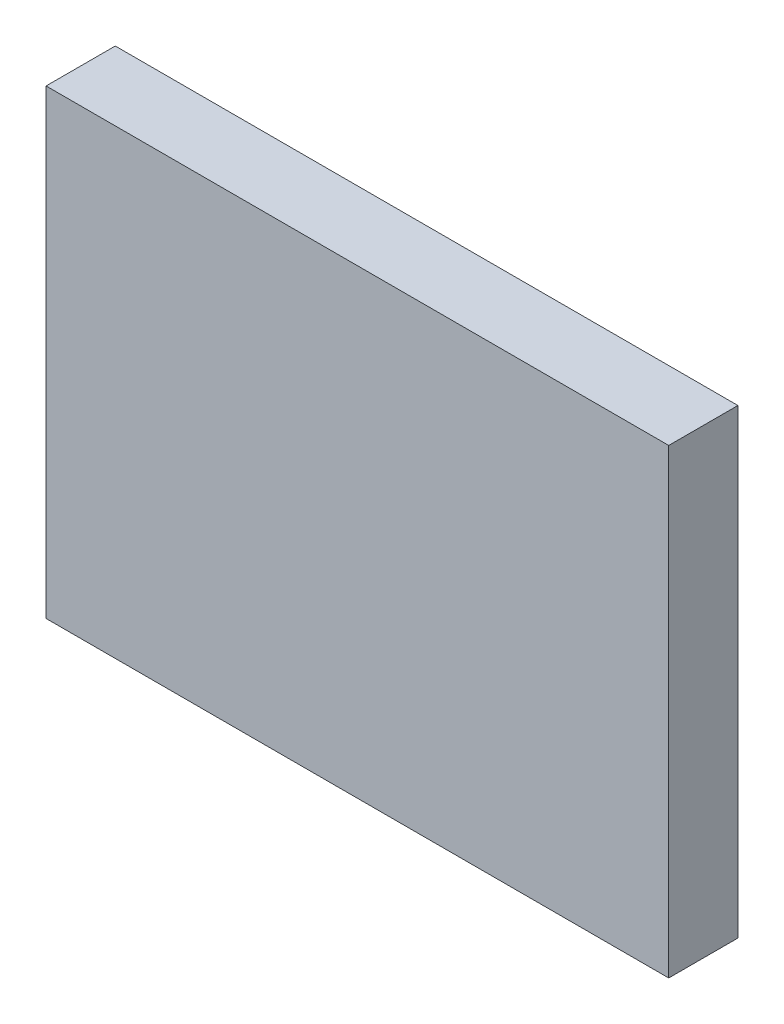
ISO-10303-21;
HEADER;
FILE_DESCRIPTION(('STEP AP214'),'2;1');
FILE_NAME('part.step','',(''),(''),'','','');
FILE_SCHEMA(('AUTOMOTIVE_DESIGN { 1 0 10303 214 1 1 1 1 }'));
ENDSEC;
DATA;
#1=APPLICATION_CONTEXT('core data for automotive mechanical design processes');
#2=APPLICATION_PROTOCOL_DEFINITION('international standard','automotive_design',2000,#1);
#3=PRODUCT_CONTEXT('',#1,'mechanical');
#4=PRODUCT('Part','Part','',(#3));
#5=PRODUCT_RELATED_PRODUCT_CATEGORY('part','',(#4));
#6=PRODUCT_DEFINITION_FORMATION('','',#4);
#7=PRODUCT_DEFINITION_CONTEXT('part definition',#1,'design');
#8=PRODUCT_DEFINITION('design','',#6,#7);
#9=PRODUCT_DEFINITION_SHAPE('','',#8);
#10=(LENGTH_UNIT() NAMED_UNIT(*) SI_UNIT(.MILLI.,.METRE.));
#11=(NAMED_UNIT(*) PLANE_ANGLE_UNIT() SI_UNIT($,.RADIAN.));
#12=(NAMED_UNIT(*) SI_UNIT($,.STERADIAN.) SOLID_ANGLE_UNIT());
#13=UNCERTAINTY_MEASURE_WITH_UNIT(LENGTH_MEASURE(1.E-05),#10,'distance_accuracy_value','');
#14=(GEOMETRIC_REPRESENTATION_CONTEXT(3) GLOBAL_UNCERTAINTY_ASSIGNED_CONTEXT((#13)) GLOBAL_UNIT_ASSIGNED_CONTEXT((#10,
#11,#12)) REPRESENTATION_CONTEXT('',''));
#15=CARTESIAN_POINT('',(0.,0.,0.));
#16=DIRECTION('',(0.,0.,1.));
#17=DIRECTION('',(1.,0.,0.));
#18=AXIS2_PLACEMENT_3D('',#15,#16,#17);
#19=CARTESIAN_POINT('',(-85.725,-63.5,9.525));
#20=DIRECTION('',(-1.,0.,0.));
#21=DIRECTION('',(0.,0.,1.));
#22=AXIS2_PLACEMENT_3D('',#19,#20,#21);
#23=PLANE('',#22);
#24=DIRECTION('',(0.,1.,0.));
#25=VECTOR('',#24,1.);
#26=CARTESIAN_POINT('',(-85.725,-63.5,-9.525));
#27=LINE('',#26,#25);
#28=CARTESIAN_POINT('',(-85.725,-63.5,-9.525));
#29=VERTEX_POINT('',#28);
#30=CARTESIAN_POINT('',(-85.725,63.5,-9.525));
#31=VERTEX_POINT('',#30);
#32=EDGE_CURVE('E110',#29,#31,#27,.T.);
#33=ORIENTED_EDGE('',*,*,#32,.F.);
#34=DIRECTION('',(0.,0.,-1.));
#35=VECTOR('',#34,1.);
#36=CARTESIAN_POINT('',(-85.725,-63.5,9.525));
#37=LINE('',#36,#35);
#38=CARTESIAN_POINT('',(-85.725,-63.5,9.525));
#39=VERTEX_POINT('',#38);
#40=EDGE_CURVE('E11',#39,#29,#37,.T.);
#41=ORIENTED_EDGE('',*,*,#40,.F.);
#42=DIRECTION('',(0.,1.,0.));
#43=VECTOR('',#42,1.);
#44=CARTESIAN_POINT('',(-85.725,-63.5,9.525));
#45=LINE('',#44,#43);
#46=CARTESIAN_POINT('',(-85.725,63.5,9.525));
#47=VERTEX_POINT('',#46);
#48=EDGE_CURVE('E103',#39,#47,#45,.T.);
#49=ORIENTED_EDGE('',*,*,#48,.T.);
#50=DIRECTION('',(0.,0.,-1.));
#51=VECTOR('',#50,1.);
#52=CARTESIAN_POINT('',(-85.725,63.5,9.525));
#53=LINE('',#52,#51);
#54=EDGE_CURVE('E42',#47,#31,#53,.T.);
#55=ORIENTED_EDGE('',*,*,#54,.T.);
#56=EDGE_LOOP('',(#33,#41,#49,#55));
#57=FACE_BOUND('',#56,.T.);
#58=ADVANCED_FACE('F39',(#57),#23,.T.);
#59=CARTESIAN_POINT('',(-85.725,-63.5,9.525));
#60=DIRECTION('',(0.,1.,0.));
#61=DIRECTION('',(0.,0.,1.));
#62=AXIS2_PLACEMENT_3D('',#59,#60,#61);
#63=PLANE('',#62);
#64=DIRECTION('',(1.,0.,0.));
#65=VECTOR('',#64,1.);
#66=CARTESIAN_POINT('',(-85.725,-63.5,-9.525));
#67=LINE('',#66,#65);
#68=CARTESIAN_POINT('',(85.725,-63.5,-9.525));
#69=VERTEX_POINT('',#68);
#70=EDGE_CURVE('E73',#29,#69,#67,.T.);
#71=ORIENTED_EDGE('',*,*,#70,.T.);
#72=DIRECTION('',(0.,0.,-1.));
#73=VECTOR('',#72,1.);
#74=CARTESIAN_POINT('',(85.725,-63.5,9.525));
#75=LINE('',#74,#73);
#76=CARTESIAN_POINT('',(85.725,-63.5,9.525));
#77=VERTEX_POINT('',#76);
#78=EDGE_CURVE('E49',#77,#69,#75,.T.);
#79=ORIENTED_EDGE('',*,*,#78,.F.);
#80=DIRECTION('',(1.,0.,0.));
#81=VECTOR('',#80,1.);
#82=CARTESIAN_POINT('',(-85.725,-63.5,9.525));
#83=LINE('',#82,#81);
#84=EDGE_CURVE('E90',#39,#77,#83,.T.);
#85=ORIENTED_EDGE('',*,*,#84,.F.);
#86=ORIENTED_EDGE('',*,*,#40,.T.);
#87=EDGE_LOOP('',(#71,#79,#85,#86));
#88=FACE_BOUND('',#87,.T.);
#89=ADVANCED_FACE('F126',(#88),#63,.F.);
#90=CARTESIAN_POINT('',(85.725,-63.5,9.525));
#91=DIRECTION('',(-1.,0.,0.));
#92=DIRECTION('',(0.,0.,1.));
#93=AXIS2_PLACEMENT_3D('',#90,#91,#92);
#94=PLANE('',#93);
#95=DIRECTION('',(0.,1.,0.));
#96=VECTOR('',#95,1.);
#97=CARTESIAN_POINT('',(85.725,-63.5,-9.525));
#98=LINE('',#97,#96);
#99=CARTESIAN_POINT('',(85.725,63.5,-9.525));
#100=VERTEX_POINT('',#99);
#101=EDGE_CURVE('E98',#69,#100,#98,.T.);
#102=ORIENTED_EDGE('',*,*,#101,.T.);
#103=DIRECTION('',(0.,0.,-1.));
#104=VECTOR('',#103,1.);
#105=CARTESIAN_POINT('',(85.725,63.5,9.525));
#106=LINE('',#105,#104);
#107=CARTESIAN_POINT('',(85.725,63.5,9.525));
#108=VERTEX_POINT('',#107);
#109=EDGE_CURVE('E95',#108,#100,#106,.T.);
#110=ORIENTED_EDGE('',*,*,#109,.F.);
#111=DIRECTION('',(0.,1.,0.));
#112=VECTOR('',#111,1.);
#113=CARTESIAN_POINT('',(85.725,-63.5,9.525));
#114=LINE('',#113,#112);
#115=EDGE_CURVE('E85',#77,#108,#114,.T.);
#116=ORIENTED_EDGE('',*,*,#115,.F.);
#117=ORIENTED_EDGE('',*,*,#78,.T.);
#118=EDGE_LOOP('',(#102,#110,#116,#117));
#119=FACE_BOUND('',#118,.T.);
#120=ADVANCED_FACE('F96',(#119),#94,.F.);
#121=CARTESIAN_POINT('',(-85.725,63.5,9.525));
#122=DIRECTION('',(0.,1.,0.));
#123=DIRECTION('',(0.,0.,1.));
#124=AXIS2_PLACEMENT_3D('',#121,#122,#123);
#125=PLANE('',#124);
#126=DIRECTION('',(1.,0.,0.));
#127=VECTOR('',#126,1.);
#128=CARTESIAN_POINT('',(-85.725,63.5,-9.525));
#129=LINE('',#128,#127);
#130=EDGE_CURVE('E114',#31,#100,#129,.T.);
#131=ORIENTED_EDGE('',*,*,#130,.F.);
#132=ORIENTED_EDGE('',*,*,#54,.F.);
#133=DIRECTION('',(1.,0.,0.));
#134=VECTOR('',#133,1.);
#135=CARTESIAN_POINT('',(-85.725,63.5,9.525));
#136=LINE('',#135,#134);
#137=EDGE_CURVE('E89',#47,#108,#136,.T.);
#138=ORIENTED_EDGE('',*,*,#137,.T.);
#139=ORIENTED_EDGE('',*,*,#109,.T.);
#140=EDGE_LOOP('',(#131,#132,#138,#139));
#141=FACE_BOUND('',#140,.T.);
#142=ADVANCED_FACE('F101',(#141),#125,.T.);
#143=CARTESIAN_POINT('',(0.,0.,9.525));
#144=DIRECTION('',(0.,0.,-1.));
#145=DIRECTION('',(-1.,0.,0.));
#146=AXIS2_PLACEMENT_3D('',#143,#144,#145);
#147=PLANE('',#146);
#148=ORIENTED_EDGE('',*,*,#48,.F.);
#149=ORIENTED_EDGE('',*,*,#84,.T.);
#150=ORIENTED_EDGE('',*,*,#115,.T.);
#151=ORIENTED_EDGE('',*,*,#137,.F.);
#152=EDGE_LOOP('',(#148,#149,#150,#151));
#153=FACE_BOUND('',#152,.T.);
#154=ADVANCED_FACE('F88',(#153),#147,.F.);
#155=CARTESIAN_POINT('',(0.,0.,-9.525));
#156=DIRECTION('',(0.,0.,-1.));
#157=DIRECTION('',(-1.,0.,0.));
#158=AXIS2_PLACEMENT_3D('',#155,#156,#157);
#159=PLANE('',#158);
#160=ORIENTED_EDGE('',*,*,#32,.T.);
#161=ORIENTED_EDGE('',*,*,#130,.T.);
#162=ORIENTED_EDGE('',*,*,#101,.F.);
#163=ORIENTED_EDGE('',*,*,#70,.F.);
#164=EDGE_LOOP('',(#160,#161,#162,#163));
#165=FACE_BOUND('',#164,.T.);
#166=ADVANCED_FACE('F123',(#165),#159,.T.);
#167=CLOSED_SHELL('',(#58,#89,#120,#142,#154,#166));
#168=MANIFOLD_SOLID_BREP('B2',#167);
#169=ADVANCED_BREP_SHAPE_REPRESENTATION('',(#18,#168),#14);
#170=SHAPE_DEFINITION_REPRESENTATION(#9,#169);
ENDSEC;
END-ISO-10303-21;
